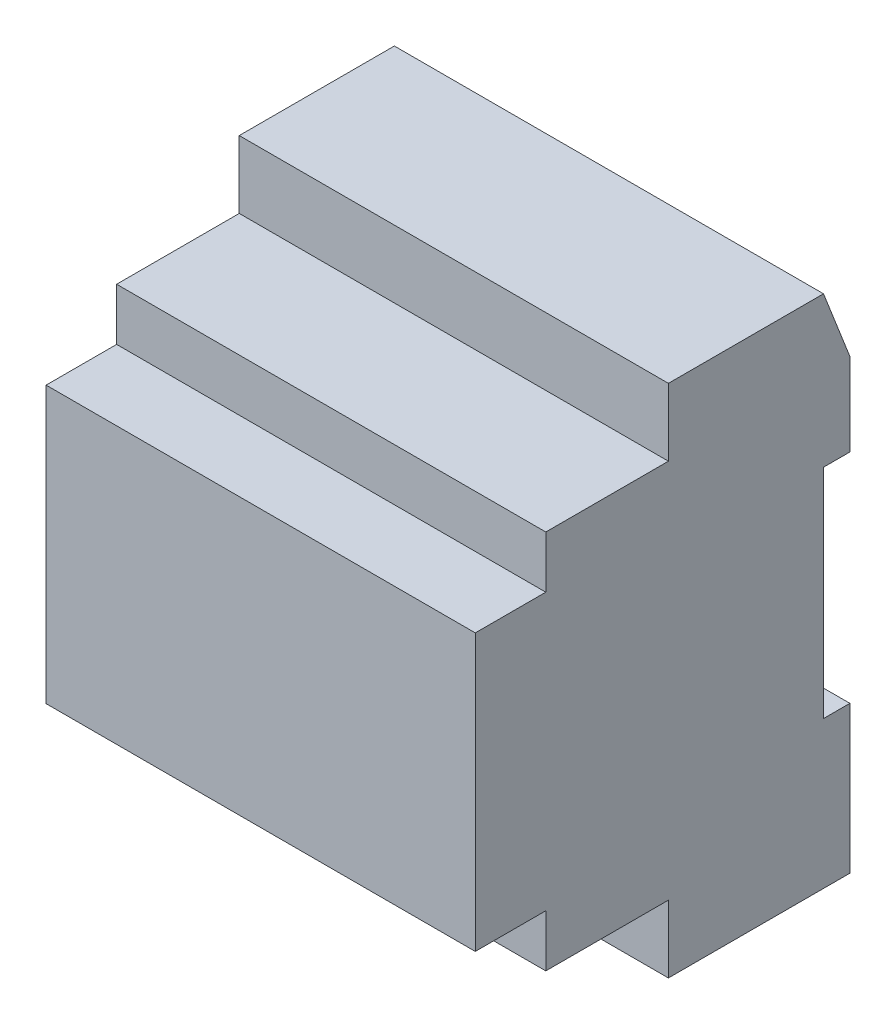
ISO-10303-21;
HEADER;
FILE_DESCRIPTION(('STEP AP214'),'2;1');
FILE_NAME('part.step','',(''),(''),'','','');
FILE_SCHEMA(('AUTOMOTIVE_DESIGN { 1 0 10303 214 1 1 1 1 }'));
ENDSEC;
DATA;
#1=APPLICATION_CONTEXT('core data for automotive mechanical design processes');
#2=APPLICATION_PROTOCOL_DEFINITION('international standard','automotive_design',2000,#1);
#3=PRODUCT_CONTEXT('',#1,'mechanical');
#4=PRODUCT('Part','Part','',(#3));
#5=PRODUCT_RELATED_PRODUCT_CATEGORY('part','',(#4));
#6=PRODUCT_DEFINITION_FORMATION('','',#4);
#7=PRODUCT_DEFINITION_CONTEXT('part definition',#1,'design');
#8=PRODUCT_DEFINITION('design','',#6,#7);
#9=PRODUCT_DEFINITION_SHAPE('','',#8);
#10=(LENGTH_UNIT() NAMED_UNIT(*) SI_UNIT(.MILLI.,.METRE.));
#11=(NAMED_UNIT(*) PLANE_ANGLE_UNIT() SI_UNIT($,.RADIAN.));
#12=(NAMED_UNIT(*) SI_UNIT($,.STERADIAN.) SOLID_ANGLE_UNIT());
#13=UNCERTAINTY_MEASURE_WITH_UNIT(LENGTH_MEASURE(1.E-05),#10,'distance_accuracy_value','');
#14=(GEOMETRIC_REPRESENTATION_CONTEXT(3) GLOBAL_UNCERTAINTY_ASSIGNED_CONTEXT((#13)) GLOBAL_UNIT_ASSIGNED_CONTEXT((#10,
#11,#12)) REPRESENTATION_CONTEXT('',''));
#15=CARTESIAN_POINT('',(0.,0.,0.));
#16=DIRECTION('',(0.,0.,1.));
#17=DIRECTION('',(1.,0.,0.));
#18=AXIS2_PLACEMENT_3D('',#15,#16,#17);
#19=CARTESIAN_POINT('',(70.,0.,29.6));
#20=DIRECTION('',(0.,1.,0.));
#21=DIRECTION('',(0.,0.,1.));
#22=AXIS2_PLACEMENT_3D('',#19,#20,#21);
#23=PLANE('',#22);
#24=DIRECTION('',(0.,0.,-1.));
#25=VECTOR('',#24,1.);
#26=CARTESIAN_POINT('',(15.,0.,0.));
#27=LINE('',#26,#25);
#28=CARTESIAN_POINT('',(15.,0.,4.3));
#29=VERTEX_POINT('',#28);
#30=CARTESIAN_POINT('',(15.,0.,0.));
#31=VERTEX_POINT('',#30);
#32=EDGE_CURVE('E59',#29,#31,#27,.T.);
#33=ORIENTED_EDGE('',*,*,#32,.F.);
#34=DIRECTION('',(-1.,0.,0.));
#35=VECTOR('',#34,1.);
#36=CARTESIAN_POINT('',(15.,0.,4.3));
#37=LINE('',#36,#35);
#38=CARTESIAN_POINT('',(55.,0.,4.3));
#39=VERTEX_POINT('',#38);
#40=EDGE_CURVE('E207',#39,#29,#37,.T.);
#41=ORIENTED_EDGE('',*,*,#40,.F.);
#42=DIRECTION('',(0.,0.,1.));
#43=VECTOR('',#42,1.);
#44=CARTESIAN_POINT('',(55.,0.,0.));
#45=LINE('',#44,#43);
#46=CARTESIAN_POINT('',(55.,0.,0.));
#47=VERTEX_POINT('',#46);
#48=EDGE_CURVE('E704',#47,#39,#45,.T.);
#49=ORIENTED_EDGE('',*,*,#48,.F.);
#50=DIRECTION('',(-1.,0.,0.));
#51=VECTOR('',#50,1.);
#52=CARTESIAN_POINT('',(70.,0.,0.));
#53=LINE('',#52,#51);
#54=CARTESIAN_POINT('',(70.,0.,0.));
#55=VERTEX_POINT('',#54);
#56=EDGE_CURVE('E361',#55,#47,#53,.T.);
#57=ORIENTED_EDGE('',*,*,#56,.F.);
#58=DIRECTION('',(0.,0.,-1.));
#59=VECTOR('',#58,1.);
#60=CARTESIAN_POINT('',(70.,0.,29.6));
#61=LINE('',#60,#59);
#62=CARTESIAN_POINT('',(70.,0.,29.6));
#63=VERTEX_POINT('',#62);
#64=EDGE_CURVE('E242',#63,#55,#61,.T.);
#65=ORIENTED_EDGE('',*,*,#64,.F.);
#66=DIRECTION('',(-1.,0.,0.));
#67=VECTOR('',#66,1.);
#68=CARTESIAN_POINT('',(70.,0.,29.6));
#69=LINE('',#68,#67);
#70=CARTESIAN_POINT('',(0.,0.,29.6));
#71=VERTEX_POINT('',#70);
#72=EDGE_CURVE('E364',#63,#71,#69,.T.);
#73=ORIENTED_EDGE('',*,*,#72,.T.);
#74=DIRECTION('',(0.,0.,-1.));
#75=VECTOR('',#74,1.);
#76=CARTESIAN_POINT('',(0.,0.,29.6));
#77=LINE('',#76,#75);
#78=CARTESIAN_POINT('',(0.,0.,0.));
#79=VERTEX_POINT('',#78);
#80=EDGE_CURVE('E290',#71,#79,#77,.T.);
#81=ORIENTED_EDGE('',*,*,#80,.T.);
#82=EDGE_CURVE('E64',#31,#79,#53,.T.);
#83=ORIENTED_EDGE('',*,*,#82,.F.);
#84=EDGE_LOOP('',(#33,#41,#49,#57,#65,#73,#81,#83));
#85=FACE_BOUND('',#84,.T.);
#86=ADVANCED_FACE('F43',(#85),#23,.F.);
#87=CARTESIAN_POINT('',(70.,64.5,49.6));
#88=DIRECTION('',(0.,-1.,0.));
#89=DIRECTION('',(0.,0.,-1.));
#90=AXIS2_PLACEMENT_3D('',#87,#88,#89);
#91=PLANE('',#90);
#92=DIRECTION('',(0.,0.,1.));
#93=VECTOR('',#92,1.);
#94=CARTESIAN_POINT('',(0.,64.5,49.6));
#95=LINE('',#94,#93);
#96=CARTESIAN_POINT('',(0.,64.5,49.6));
#97=VERTEX_POINT('',#96);
#98=CARTESIAN_POINT('',(0.,64.5,61.1));
#99=VERTEX_POINT('',#98);
#100=EDGE_CURVE('E211',#97,#99,#95,.T.);
#101=ORIENTED_EDGE('',*,*,#100,.T.);
#102=DIRECTION('',(-1.,0.,0.));
#103=VECTOR('',#102,1.);
#104=CARTESIAN_POINT('',(70.,64.5,61.1));
#105=LINE('',#104,#103);
#106=CARTESIAN_POINT('',(70.,64.5,61.1));
#107=VERTEX_POINT('',#106);
#108=EDGE_CURVE('E11',#107,#99,#105,.T.);
#109=ORIENTED_EDGE('',*,*,#108,.F.);
#110=DIRECTION('',(0.,0.,1.));
#111=VECTOR('',#110,1.);
#112=CARTESIAN_POINT('',(70.,64.5,49.6));
#113=LINE('',#112,#111);
#114=CARTESIAN_POINT('',(70.,64.5,49.6));
#115=VERTEX_POINT('',#114);
#116=EDGE_CURVE('E222',#115,#107,#113,.T.);
#117=ORIENTED_EDGE('',*,*,#116,.F.);
#118=DIRECTION('',(-1.,0.,0.));
#119=VECTOR('',#118,1.);
#120=CARTESIAN_POINT('',(70.,64.5,49.6));
#121=LINE('',#120,#119);
#122=EDGE_CURVE('E274',#115,#97,#121,.T.);
#123=ORIENTED_EDGE('',*,*,#122,.T.);
#124=EDGE_LOOP('',(#101,#109,#117,#123));
#125=FACE_BOUND('',#124,.T.);
#126=ADVANCED_FACE('F45',(#125),#91,.F.);
#127=CARTESIAN_POINT('',(70.,64.5,61.1));
#128=DIRECTION('',(0.,0.,-1.));
#129=DIRECTION('',(-1.,0.,0.));
#130=AXIS2_PLACEMENT_3D('',#127,#128,#129);
#131=PLANE('',#130);
#132=DIRECTION('',(0.,-1.,0.));
#133=VECTOR('',#132,1.);
#134=CARTESIAN_POINT('',(0.,64.5,61.1));
#135=LINE('',#134,#133);
#136=CARTESIAN_POINT('',(0.,19.5,61.1));
#137=VERTEX_POINT('',#136);
#138=EDGE_CURVE('E216',#99,#137,#135,.T.);
#139=ORIENTED_EDGE('',*,*,#138,.T.);
#140=DIRECTION('',(-1.,0.,0.));
#141=VECTOR('',#140,1.);
#142=CARTESIAN_POINT('',(70.,19.5,61.1));
#143=LINE('',#142,#141);
#144=CARTESIAN_POINT('',(70.,19.5,61.1));
#145=VERTEX_POINT('',#144);
#146=EDGE_CURVE('E52',#145,#137,#143,.T.);
#147=ORIENTED_EDGE('',*,*,#146,.F.);
#148=DIRECTION('',(0.,-1.,0.));
#149=VECTOR('',#148,1.);
#150=CARTESIAN_POINT('',(70.,64.5,61.1));
#151=LINE('',#150,#149);
#152=EDGE_CURVE('E226',#107,#145,#151,.T.);
#153=ORIENTED_EDGE('',*,*,#152,.F.);
#154=ORIENTED_EDGE('',*,*,#108,.T.);
#155=EDGE_LOOP('',(#139,#147,#153,#154));
#156=FACE_BOUND('',#155,.T.);
#157=ADVANCED_FACE('F408',(#156),#131,.F.);
#158=CARTESIAN_POINT('',(70.,19.5,61.1));
#159=DIRECTION('',(0.,1.,0.));
#160=DIRECTION('',(0.,0.,1.));
#161=AXIS2_PLACEMENT_3D('',#158,#159,#160);
#162=PLANE('',#161);
#163=DIRECTION('',(0.,0.,-1.));
#164=VECTOR('',#163,1.);
#165=CARTESIAN_POINT('',(0.,19.5,61.1));
#166=LINE('',#165,#164);
#167=CARTESIAN_POINT('',(0.,19.5,49.6));
#168=VERTEX_POINT('',#167);
#169=EDGE_CURVE('E278',#137,#168,#166,.T.);
#170=ORIENTED_EDGE('',*,*,#169,.T.);
#171=DIRECTION('',(-1.,0.,0.));
#172=VECTOR('',#171,1.);
#173=CARTESIAN_POINT('',(70.,19.5,49.6));
#174=LINE('',#173,#172);
#175=CARTESIAN_POINT('',(70.,19.5,49.6));
#176=VERTEX_POINT('',#175);
#177=EDGE_CURVE('E376',#176,#168,#174,.T.);
#178=ORIENTED_EDGE('',*,*,#177,.F.);
#179=DIRECTION('',(0.,0.,-1.));
#180=VECTOR('',#179,1.);
#181=CARTESIAN_POINT('',(70.,19.5,61.1));
#182=LINE('',#181,#180);
#183=EDGE_CURVE('E230',#145,#176,#182,.T.);
#184=ORIENTED_EDGE('',*,*,#183,.F.);
#185=ORIENTED_EDGE('',*,*,#146,.T.);
#186=EDGE_LOOP('',(#170,#178,#184,#185));
#187=FACE_BOUND('',#186,.T.);
#188=ADVANCED_FACE('F385',(#187),#162,.F.);
#189=CARTESIAN_POINT('',(70.,19.5,49.6));
#190=DIRECTION('',(0.,0.,-1.));
#191=DIRECTION('',(-1.,0.,0.));
#192=AXIS2_PLACEMENT_3D('',#189,#190,#191);
#193=PLANE('',#192);
#194=DIRECTION('',(0.,-1.,0.));
#195=VECTOR('',#194,1.);
#196=CARTESIAN_POINT('',(0.,19.5,49.6));
#197=LINE('',#196,#195);
#198=CARTESIAN_POINT('',(0.,11.,49.6));
#199=VERTEX_POINT('',#198);
#200=EDGE_CURVE('E281',#168,#199,#197,.T.);
#201=ORIENTED_EDGE('',*,*,#200,.T.);
#202=DIRECTION('',(-1.,0.,0.));
#203=VECTOR('',#202,1.);
#204=CARTESIAN_POINT('',(70.,11.,49.6));
#205=LINE('',#204,#203);
#206=CARTESIAN_POINT('',(70.,11.,49.6));
#207=VERTEX_POINT('',#206);
#208=EDGE_CURVE('E372',#207,#199,#205,.T.);
#209=ORIENTED_EDGE('',*,*,#208,.F.);
#210=DIRECTION('',(0.,-1.,0.));
#211=VECTOR('',#210,1.);
#212=CARTESIAN_POINT('',(70.,19.5,49.6));
#213=LINE('',#212,#211);
#214=EDGE_CURVE('E233',#176,#207,#213,.T.);
#215=ORIENTED_EDGE('',*,*,#214,.F.);
#216=ORIENTED_EDGE('',*,*,#177,.T.);
#217=EDGE_LOOP('',(#201,#209,#215,#216));
#218=FACE_BOUND('',#217,.T.);
#219=ADVANCED_FACE('F396',(#218),#193,.F.);
#220=CARTESIAN_POINT('',(70.,11.,49.6));
#221=DIRECTION('',(0.,1.,0.));
#222=DIRECTION('',(0.,0.,1.));
#223=AXIS2_PLACEMENT_3D('',#220,#221,#222);
#224=PLANE('',#223);
#225=DIRECTION('',(0.,0.,-1.));
#226=VECTOR('',#225,1.);
#227=CARTESIAN_POINT('',(0.,11.,49.6));
#228=LINE('',#227,#226);
#229=CARTESIAN_POINT('',(0.,11.,29.6));
#230=VERTEX_POINT('',#229);
#231=EDGE_CURVE('E284',#199,#230,#228,.T.);
#232=ORIENTED_EDGE('',*,*,#231,.T.);
#233=DIRECTION('',(-1.,0.,0.));
#234=VECTOR('',#233,1.);
#235=CARTESIAN_POINT('',(70.,11.,29.6));
#236=LINE('',#235,#234);
#237=CARTESIAN_POINT('',(70.,11.,29.6));
#238=VERTEX_POINT('',#237);
#239=EDGE_CURVE('E368',#238,#230,#236,.T.);
#240=ORIENTED_EDGE('',*,*,#239,.F.);
#241=DIRECTION('',(0.,0.,-1.));
#242=VECTOR('',#241,1.);
#243=CARTESIAN_POINT('',(70.,11.,49.6));
#244=LINE('',#243,#242);
#245=EDGE_CURVE('E236',#207,#238,#244,.T.);
#246=ORIENTED_EDGE('',*,*,#245,.F.);
#247=ORIENTED_EDGE('',*,*,#208,.T.);
#248=EDGE_LOOP('',(#232,#240,#246,#247));
#249=FACE_BOUND('',#248,.T.);
#250=ADVANCED_FACE('F400',(#249),#224,.F.);
#251=CARTESIAN_POINT('',(70.,11.,29.6));
#252=DIRECTION('',(0.,0.,-1.));
#253=DIRECTION('',(-1.,0.,0.));
#254=AXIS2_PLACEMENT_3D('',#251,#252,#253);
#255=PLANE('',#254);
#256=DIRECTION('',(0.,-1.,0.));
#257=VECTOR('',#256,1.);
#258=CARTESIAN_POINT('',(0.,11.,29.6));
#259=LINE('',#258,#257);
#260=EDGE_CURVE('E287',#230,#71,#259,.T.);
#261=ORIENTED_EDGE('',*,*,#260,.T.);
#262=ORIENTED_EDGE('',*,*,#72,.F.);
#263=DIRECTION('',(0.,-1.,0.));
#264=VECTOR('',#263,1.);
#265=CARTESIAN_POINT('',(70.,11.,29.6));
#266=LINE('',#265,#264);
#267=EDGE_CURVE('E239',#238,#63,#266,.T.);
#268=ORIENTED_EDGE('',*,*,#267,.F.);
#269=ORIENTED_EDGE('',*,*,#239,.T.);
#270=EDGE_LOOP('',(#261,#262,#268,#269));
#271=FACE_BOUND('',#270,.T.);
#272=ADVANCED_FACE('F463',(#271),#255,.F.);
#273=CARTESIAN_POINT('',(70.,0.,0.));
#274=DIRECTION('',(0.,0.,1.));
#275=DIRECTION('',(1.,0.,0.));
#276=AXIS2_PLACEMENT_3D('',#273,#274,#275);
#277=PLANE('',#276);
#278=DIRECTION('',(0.,1.,0.));
#279=VECTOR('',#278,1.);
#280=CARTESIAN_POINT('',(0.,0.,0.));
#281=LINE('',#280,#279);
#282=CARTESIAN_POINT('',(0.,24.,0.));
#283=VERTEX_POINT('',#282);
#284=EDGE_CURVE('E293',#79,#283,#281,.T.);
#285=ORIENTED_EDGE('',*,*,#284,.T.);
#286=DIRECTION('',(-1.,0.,0.));
#287=VECTOR('',#286,1.);
#288=CARTESIAN_POINT('',(70.,24.,0.));
#289=LINE('',#288,#287);
#290=CARTESIAN_POINT('',(70.,24.,0.));
#291=VERTEX_POINT('',#290);
#292=EDGE_CURVE('E357',#291,#283,#289,.T.);
#293=ORIENTED_EDGE('',*,*,#292,.F.);
#294=DIRECTION('',(0.,1.,0.));
#295=VECTOR('',#294,1.);
#296=CARTESIAN_POINT('',(70.,0.,0.));
#297=LINE('',#296,#295);
#298=EDGE_CURVE('E245',#55,#291,#297,.T.);
#299=ORIENTED_EDGE('',*,*,#298,.F.);
#300=ORIENTED_EDGE('',*,*,#56,.T.);
#301=DIRECTION('',(0.,1.,0.));
#302=VECTOR('',#301,1.);
#303=CARTESIAN_POINT('',(55.,-4.8,0.));
#304=LINE('',#303,#302);
#305=CARTESIAN_POINT('',(55.,-4.8,0.));
#306=VERTEX_POINT('',#305);
#307=EDGE_CURVE('E192',#306,#47,#304,.T.);
#308=ORIENTED_EDGE('',*,*,#307,.F.);
#309=DIRECTION('',(1.,0.,0.));
#310=VECTOR('',#309,1.);
#311=CARTESIAN_POINT('',(15.,-4.8,0.));
#312=LINE('',#311,#310);
#313=CARTESIAN_POINT('',(15.,-4.8,0.));
#314=VERTEX_POINT('',#313);
#315=EDGE_CURVE('E185',#314,#306,#312,.T.);
#316=ORIENTED_EDGE('',*,*,#315,.F.);
#317=DIRECTION('',(0.,1.,0.));
#318=VECTOR('',#317,1.);
#319=CARTESIAN_POINT('',(15.,-4.8,0.));
#320=LINE('',#319,#318);
#321=EDGE_CURVE('E189',#314,#31,#320,.T.);
#322=ORIENTED_EDGE('',*,*,#321,.T.);
#323=ORIENTED_EDGE('',*,*,#82,.T.);
#324=EDGE_LOOP('',(#285,#293,#299,#300,#308,#316,#322,#323));
#325=FACE_BOUND('',#324,.T.);
#326=ADVANCED_FACE('F187',(#325),#277,.F.);
#327=CARTESIAN_POINT('',(70.,24.,0.));
#328=DIRECTION('',(0.,-1.,0.));
#329=DIRECTION('',(0.,0.,-1.));
#330=AXIS2_PLACEMENT_3D('',#327,#328,#329);
#331=PLANE('',#330);
#332=DIRECTION('',(0.,0.,1.));
#333=VECTOR('',#332,1.);
#334=CARTESIAN_POINT('',(0.,24.,0.));
#335=LINE('',#334,#333);
#336=CARTESIAN_POINT('',(0.,24.,4.30000000000001));
#337=VERTEX_POINT('',#336);
#338=EDGE_CURVE('E296',#283,#337,#335,.T.);
#339=ORIENTED_EDGE('',*,*,#338,.T.);
#340=DIRECTION('',(-1.,0.,0.));
#341=VECTOR('',#340,1.);
#342=CARTESIAN_POINT('',(70.,24.,4.30000000000001));
#343=LINE('',#342,#341);
#344=CARTESIAN_POINT('',(70.,24.,4.30000000000001));
#345=VERTEX_POINT('',#344);
#346=EDGE_CURVE('E353',#345,#337,#343,.T.);
#347=ORIENTED_EDGE('',*,*,#346,.F.);
#348=DIRECTION('',(0.,0.,1.));
#349=VECTOR('',#348,1.);
#350=CARTESIAN_POINT('',(70.,24.,0.));
#351=LINE('',#350,#349);
#352=EDGE_CURVE('E248',#291,#345,#351,.T.);
#353=ORIENTED_EDGE('',*,*,#352,.F.);
#354=ORIENTED_EDGE('',*,*,#292,.T.);
#355=EDGE_LOOP('',(#339,#347,#353,#354));
#356=FACE_BOUND('',#355,.T.);
#357=ADVANCED_FACE('F454',(#356),#331,.F.);
#358=CARTESIAN_POINT('',(70.,24.,4.30000000000001));
#359=DIRECTION('',(0.,0.,1.));
#360=DIRECTION('',(0.,-1.,0.));
#361=AXIS2_PLACEMENT_3D('',#358,#359,#360);
#362=PLANE('',#361);
#363=DIRECTION('',(0.,1.,0.));
#364=VECTOR('',#363,1.);
#365=CARTESIAN_POINT('',(0.,24.,4.30000000000001));
#366=LINE('',#365,#364);
#367=CARTESIAN_POINT('',(0.,59.5,4.30000000000002));
#368=VERTEX_POINT('',#367);
#369=EDGE_CURVE('E299',#337,#368,#366,.T.);
#370=ORIENTED_EDGE('',*,*,#369,.T.);
#371=DIRECTION('',(-1.,0.,0.));
#372=VECTOR('',#371,1.);
#373=CARTESIAN_POINT('',(70.,59.5,4.30000000000002));
#374=LINE('',#373,#372);
#375=CARTESIAN_POINT('',(70.,59.5,4.30000000000002));
#376=VERTEX_POINT('',#375);
#377=EDGE_CURVE('E349',#376,#368,#374,.T.);
#378=ORIENTED_EDGE('',*,*,#377,.F.);
#379=DIRECTION('',(0.,1.,0.));
#380=VECTOR('',#379,1.);
#381=CARTESIAN_POINT('',(70.,24.,4.30000000000001));
#382=LINE('',#381,#380);
#383=EDGE_CURVE('E251',#345,#376,#382,.T.);
#384=ORIENTED_EDGE('',*,*,#383,.F.);
#385=ORIENTED_EDGE('',*,*,#346,.T.);
#386=EDGE_LOOP('',(#370,#378,#384,#385));
#387=FACE_BOUND('',#386,.T.);
#388=ADVANCED_FACE('F450',(#387),#362,.F.);
#389=CARTESIAN_POINT('',(70.,59.5,4.30000000000002));
#390=DIRECTION('',(0.,1.,0.));
#391=DIRECTION('',(0.,0.,1.));
#392=AXIS2_PLACEMENT_3D('',#389,#390,#391);
#393=PLANE('',#392);
#394=DIRECTION('',(0.,0.,-1.));
#395=VECTOR('',#394,1.);
#396=CARTESIAN_POINT('',(0.,59.5,4.30000000000002));
#397=LINE('',#396,#395);
#398=CARTESIAN_POINT('',(0.,59.5,0.));
#399=VERTEX_POINT('',#398);
#400=EDGE_CURVE('E302',#368,#399,#397,.T.);
#401=ORIENTED_EDGE('',*,*,#400,.T.);
#402=DIRECTION('',(-1.,0.,0.));
#403=VECTOR('',#402,1.);
#404=CARTESIAN_POINT('',(70.,59.5,0.));
#405=LINE('',#404,#403);
#406=CARTESIAN_POINT('',(70.,59.5,0.));
#407=VERTEX_POINT('',#406);
#408=EDGE_CURVE('E345',#407,#399,#405,.T.);
#409=ORIENTED_EDGE('',*,*,#408,.F.);
#410=DIRECTION('',(0.,0.,-1.));
#411=VECTOR('',#410,1.);
#412=CARTESIAN_POINT('',(70.,59.5,4.30000000000002));
#413=LINE('',#412,#411);
#414=EDGE_CURVE('E254',#376,#407,#413,.T.);
#415=ORIENTED_EDGE('',*,*,#414,.F.);
#416=ORIENTED_EDGE('',*,*,#377,.T.);
#417=EDGE_LOOP('',(#401,#409,#415,#416));
#418=FACE_BOUND('',#417,.T.);
#419=ADVANCED_FACE('F445',(#418),#393,.F.);
#420=CARTESIAN_POINT('',(70.,59.5,0.));
#421=DIRECTION('',(0.,0.,1.));
#422=DIRECTION('',(1.,0.,0.));
#423=AXIS2_PLACEMENT_3D('',#420,#421,#422);
#424=PLANE('',#423);
#425=DIRECTION('',(0.,1.,0.));
#426=VECTOR('',#425,1.);
#427=CARTESIAN_POINT('',(0.,59.5,0.));
#428=LINE('',#427,#426);
#429=CARTESIAN_POINT('',(0.,73.,0.));
#430=VERTEX_POINT('',#429);
#431=EDGE_CURVE('E305',#399,#430,#428,.T.);
#432=ORIENTED_EDGE('',*,*,#431,.T.);
#433=DIRECTION('',(-1.,0.,0.));
#434=VECTOR('',#433,1.);
#435=CARTESIAN_POINT('',(70.,73.,0.));
#436=LINE('',#435,#434);
#437=CARTESIAN_POINT('',(70.,73.,0.));
#438=VERTEX_POINT('',#437);
#439=EDGE_CURVE('E341',#438,#430,#436,.T.);
#440=ORIENTED_EDGE('',*,*,#439,.F.);
#441=DIRECTION('',(0.,1.,0.));
#442=VECTOR('',#441,1.);
#443=CARTESIAN_POINT('',(70.,59.5,0.));
#444=LINE('',#443,#442);
#445=EDGE_CURVE('E257',#407,#438,#444,.T.);
#446=ORIENTED_EDGE('',*,*,#445,.F.);
#447=ORIENTED_EDGE('',*,*,#408,.T.);
#448=EDGE_LOOP('',(#432,#440,#446,#447));
#449=FACE_BOUND('',#448,.T.);
#450=ADVANCED_FACE('F439',(#449),#424,.F.);
#451=CARTESIAN_POINT('',(70.,73.,0.));
#452=DIRECTION('',(0.,-0.364080080432999,0.931367647619296));
#453=DIRECTION('',(0.,-0.931367647619296,-0.364080080432999));
#454=AXIS2_PLACEMENT_3D('',#451,#452,#453);
#455=PLANE('',#454);
#456=DIRECTION('',(0.,0.931367647619296,0.364080080432999));
#457=VECTOR('',#456,1.);
#458=CARTESIAN_POINT('',(0.,73.,0.));
#459=LINE('',#458,#457);
#460=CARTESIAN_POINT('',(0.,84.,4.30000000000002));
#461=VERTEX_POINT('',#460);
#462=EDGE_CURVE('E308',#430,#461,#459,.T.);
#463=ORIENTED_EDGE('',*,*,#462,.T.);
#464=DIRECTION('',(-1.,0.,0.));
#465=VECTOR('',#464,1.);
#466=CARTESIAN_POINT('',(70.,84.,4.30000000000002));
#467=LINE('',#466,#465);
#468=CARTESIAN_POINT('',(70.,84.,4.30000000000002));
#469=VERTEX_POINT('',#468);
#470=EDGE_CURVE('E337',#469,#461,#467,.T.);
#471=ORIENTED_EDGE('',*,*,#470,.F.);
#472=DIRECTION('',(0.,0.931367647619296,0.364080080432999));
#473=VECTOR('',#472,1.);
#474=CARTESIAN_POINT('',(70.,73.,0.));
#475=LINE('',#474,#473);
#476=EDGE_CURVE('E260',#438,#469,#475,.T.);
#477=ORIENTED_EDGE('',*,*,#476,.F.);
#478=ORIENTED_EDGE('',*,*,#439,.T.);
#479=EDGE_LOOP('',(#463,#471,#477,#478));
#480=FACE_BOUND('',#479,.T.);
#481=ADVANCED_FACE('F435',(#480),#455,.F.);
#482=CARTESIAN_POINT('',(70.,84.,4.30000000000002));
#483=DIRECTION('',(0.,-1.,0.));
#484=DIRECTION('',(0.,0.,-1.));
#485=AXIS2_PLACEMENT_3D('',#482,#483,#484);
#486=PLANE('',#485);
#487=DIRECTION('',(0.,0.,1.));
#488=VECTOR('',#487,1.);
#489=CARTESIAN_POINT('',(0.,84.,4.30000000000002));
#490=LINE('',#489,#488);
#491=CARTESIAN_POINT('',(0.,84.,29.6));
#492=VERTEX_POINT('',#491);
#493=EDGE_CURVE('E311',#461,#492,#490,.T.);
#494=ORIENTED_EDGE('',*,*,#493,.T.);
#495=DIRECTION('',(-1.,0.,0.));
#496=VECTOR('',#495,1.);
#497=CARTESIAN_POINT('',(70.,84.,29.6));
#498=LINE('',#497,#496);
#499=CARTESIAN_POINT('',(70.,84.,29.6));
#500=VERTEX_POINT('',#499);
#501=EDGE_CURVE('E333',#500,#492,#498,.T.);
#502=ORIENTED_EDGE('',*,*,#501,.F.);
#503=DIRECTION('',(0.,0.,1.));
#504=VECTOR('',#503,1.);
#505=CARTESIAN_POINT('',(70.,84.,4.30000000000002));
#506=LINE('',#505,#504);
#507=EDGE_CURVE('E263',#469,#500,#506,.T.);
#508=ORIENTED_EDGE('',*,*,#507,.F.);
#509=ORIENTED_EDGE('',*,*,#470,.T.);
#510=EDGE_LOOP('',(#494,#502,#508,#509));
#511=FACE_BOUND('',#510,.T.);
#512=ADVANCED_FACE('F430',(#511),#486,.F.);
#513=CARTESIAN_POINT('',(70.,84.,29.6));
#514=DIRECTION('',(0.,0.,-1.));
#515=DIRECTION('',(0.,1.,0.));
#516=AXIS2_PLACEMENT_3D('',#513,#514,#515);
#517=PLANE('',#516);
#518=DIRECTION('',(0.,-1.,0.));
#519=VECTOR('',#518,1.);
#520=CARTESIAN_POINT('',(0.,84.,29.6));
#521=LINE('',#520,#519);
#522=CARTESIAN_POINT('',(0.,73.,29.6));
#523=VERTEX_POINT('',#522);
#524=EDGE_CURVE('E314',#492,#523,#521,.T.);
#525=ORIENTED_EDGE('',*,*,#524,.T.);
#526=DIRECTION('',(-1.,0.,0.));
#527=VECTOR('',#526,1.);
#528=CARTESIAN_POINT('',(70.,73.,29.6));
#529=LINE('',#528,#527);
#530=CARTESIAN_POINT('',(70.,73.,29.6));
#531=VERTEX_POINT('',#530);
#532=EDGE_CURVE('E329',#531,#523,#529,.T.);
#533=ORIENTED_EDGE('',*,*,#532,.F.);
#534=DIRECTION('',(0.,-1.,0.));
#535=VECTOR('',#534,1.);
#536=CARTESIAN_POINT('',(70.,84.,29.6));
#537=LINE('',#536,#535);
#538=EDGE_CURVE('E266',#500,#531,#537,.T.);
#539=ORIENTED_EDGE('',*,*,#538,.F.);
#540=ORIENTED_EDGE('',*,*,#501,.T.);
#541=EDGE_LOOP('',(#525,#533,#539,#540));
#542=FACE_BOUND('',#541,.T.);
#543=ADVANCED_FACE('F424',(#542),#517,.F.);
#544=CARTESIAN_POINT('',(70.,73.,29.6));
#545=DIRECTION('',(0.,-1.,0.));
#546=DIRECTION('',(0.,0.,-1.));
#547=AXIS2_PLACEMENT_3D('',#544,#545,#546);
#548=PLANE('',#547);
#549=DIRECTION('',(0.,0.,1.));
#550=VECTOR('',#549,1.);
#551=CARTESIAN_POINT('',(0.,73.,29.6));
#552=LINE('',#551,#550);
#553=CARTESIAN_POINT('',(0.,73.,49.6));
#554=VERTEX_POINT('',#553);
#555=EDGE_CURVE('E317',#523,#554,#552,.T.);
#556=ORIENTED_EDGE('',*,*,#555,.T.);
#557=DIRECTION('',(-1.,0.,0.));
#558=VECTOR('',#557,1.);
#559=CARTESIAN_POINT('',(70.,73.,49.6));
#560=LINE('',#559,#558);
#561=CARTESIAN_POINT('',(70.,73.,49.6));
#562=VERTEX_POINT('',#561);
#563=EDGE_CURVE('E325',#562,#554,#560,.T.);
#564=ORIENTED_EDGE('',*,*,#563,.F.);
#565=DIRECTION('',(0.,0.,1.));
#566=VECTOR('',#565,1.);
#567=CARTESIAN_POINT('',(70.,73.,29.6));
#568=LINE('',#567,#566);
#569=EDGE_CURVE('E269',#531,#562,#568,.T.);
#570=ORIENTED_EDGE('',*,*,#569,.F.);
#571=ORIENTED_EDGE('',*,*,#532,.T.);
#572=EDGE_LOOP('',(#556,#564,#570,#571));
#573=FACE_BOUND('',#572,.T.);
#574=ADVANCED_FACE('F420',(#573),#548,.F.);
#575=CARTESIAN_POINT('',(70.,73.,49.6));
#576=DIRECTION('',(0.,0.,-1.));
#577=DIRECTION('',(0.,1.,0.));
#578=AXIS2_PLACEMENT_3D('',#575,#576,#577);
#579=PLANE('',#578);
#580=DIRECTION('',(0.,-1.,0.));
#581=VECTOR('',#580,1.);
#582=CARTESIAN_POINT('',(0.,73.,49.6));
#583=LINE('',#582,#581);
#584=EDGE_CURVE('E227',#554,#97,#583,.T.);
#585=ORIENTED_EDGE('',*,*,#584,.T.);
#586=ORIENTED_EDGE('',*,*,#122,.F.);
#587=DIRECTION('',(0.,-1.,0.));
#588=VECTOR('',#587,1.);
#589=CARTESIAN_POINT('',(70.,73.,49.6));
#590=LINE('',#589,#588);
#591=EDGE_CURVE('E272',#562,#115,#590,.T.);
#592=ORIENTED_EDGE('',*,*,#591,.F.);
#593=ORIENTED_EDGE('',*,*,#563,.T.);
#594=EDGE_LOOP('',(#585,#586,#592,#593));
#595=FACE_BOUND('',#594,.T.);
#596=ADVANCED_FACE('F415',(#595),#579,.F.);
#597=CARTESIAN_POINT('',(70.,0.,0.));
#598=DIRECTION('',(1.,0.,0.));
#599=DIRECTION('',(0.,0.,-1.));
#600=AXIS2_PLACEMENT_3D('',#597,#598,#599);
#601=PLANE('',#600);
#602=ORIENTED_EDGE('',*,*,#116,.T.);
#603=ORIENTED_EDGE('',*,*,#152,.T.);
#604=ORIENTED_EDGE('',*,*,#183,.T.);
#605=ORIENTED_EDGE('',*,*,#214,.T.);
#606=ORIENTED_EDGE('',*,*,#245,.T.);
#607=ORIENTED_EDGE('',*,*,#267,.T.);
#608=ORIENTED_EDGE('',*,*,#64,.T.);
#609=ORIENTED_EDGE('',*,*,#298,.T.);
#610=ORIENTED_EDGE('',*,*,#352,.T.);
#611=ORIENTED_EDGE('',*,*,#383,.T.);
#612=ORIENTED_EDGE('',*,*,#414,.T.);
#613=ORIENTED_EDGE('',*,*,#445,.T.);
#614=ORIENTED_EDGE('',*,*,#476,.T.);
#615=ORIENTED_EDGE('',*,*,#507,.T.);
#616=ORIENTED_EDGE('',*,*,#538,.T.);
#617=ORIENTED_EDGE('',*,*,#569,.T.);
#618=ORIENTED_EDGE('',*,*,#591,.T.);
#619=EDGE_LOOP('',(#602,#603,#604,#605,#606,#607,#608,#609,#610,#611,#612,#613,#614,#615,#616,
#617,#618));
#620=FACE_BOUND('',#619,.T.);
#621=ADVANCED_FACE('F404',(#620),#601,.T.);
#622=CARTESIAN_POINT('',(0.,0.,0.));
#623=DIRECTION('',(1.,0.,0.));
#624=DIRECTION('',(0.,0.,-1.));
#625=AXIS2_PLACEMENT_3D('',#622,#623,#624);
#626=PLANE('',#625);
#627=ORIENTED_EDGE('',*,*,#100,.F.);
#628=ORIENTED_EDGE('',*,*,#584,.F.);
#629=ORIENTED_EDGE('',*,*,#555,.F.);
#630=ORIENTED_EDGE('',*,*,#524,.F.);
#631=ORIENTED_EDGE('',*,*,#493,.F.);
#632=ORIENTED_EDGE('',*,*,#462,.F.);
#633=ORIENTED_EDGE('',*,*,#431,.F.);
#634=ORIENTED_EDGE('',*,*,#400,.F.);
#635=ORIENTED_EDGE('',*,*,#369,.F.);
#636=ORIENTED_EDGE('',*,*,#338,.F.);
#637=ORIENTED_EDGE('',*,*,#284,.F.);
#638=ORIENTED_EDGE('',*,*,#80,.F.);
#639=ORIENTED_EDGE('',*,*,#260,.F.);
#640=ORIENTED_EDGE('',*,*,#231,.F.);
#641=ORIENTED_EDGE('',*,*,#200,.F.);
#642=ORIENTED_EDGE('',*,*,#169,.F.);
#643=ORIENTED_EDGE('',*,*,#138,.F.);
#644=EDGE_LOOP('',(#627,#628,#629,#630,#631,#632,#633,#634,#635,#636,#637,#638,#639,#640,#641,
#642,#643));
#645=FACE_BOUND('',#644,.T.);
#646=ADVANCED_FACE('F391',(#645),#626,.F.);
#647=CARTESIAN_POINT('',(15.,-4.8,0.));
#648=DIRECTION('',(1.,0.,0.));
#649=DIRECTION('',(0.,0.,-1.));
#650=AXIS2_PLACEMENT_3D('',#647,#648,#649);
#651=PLANE('',#650);
#652=ORIENTED_EDGE('',*,*,#32,.T.);
#653=ORIENTED_EDGE('',*,*,#321,.F.);
#654=DIRECTION('',(0.,0.,-1.));
#655=VECTOR('',#654,1.);
#656=CARTESIAN_POINT('',(15.,-4.8,0.));
#657=LINE('',#656,#655);
#658=CARTESIAN_POINT('',(15.,-4.8,4.3));
#659=VERTEX_POINT('',#658);
#660=EDGE_CURVE('E197',#659,#314,#657,.T.);
#661=ORIENTED_EDGE('',*,*,#660,.F.);
#662=DIRECTION('',(0.,1.,0.));
#663=VECTOR('',#662,1.);
#664=CARTESIAN_POINT('',(15.,-4.8,4.3));
#665=LINE('',#664,#663);
#666=EDGE_CURVE('E700',#659,#29,#665,.T.);
#667=ORIENTED_EDGE('',*,*,#666,.T.);
#668=EDGE_LOOP('',(#652,#653,#661,#667));
#669=FACE_BOUND('',#668,.T.);
#670=ADVANCED_FACE('F209',(#669),#651,.F.);
#671=CARTESIAN_POINT('',(55.,-4.8,0.));
#672=DIRECTION('',(-1.,0.,0.));
#673=DIRECTION('',(0.,0.,1.));
#674=AXIS2_PLACEMENT_3D('',#671,#672,#673);
#675=PLANE('',#674);
#676=ORIENTED_EDGE('',*,*,#48,.T.);
#677=DIRECTION('',(0.,1.,0.));
#678=VECTOR('',#677,1.);
#679=CARTESIAN_POINT('',(55.,-4.8,4.3));
#680=LINE('',#679,#678);
#681=CARTESIAN_POINT('',(55.,-4.8,4.3));
#682=VERTEX_POINT('',#681);
#683=EDGE_CURVE('E218',#682,#39,#680,.T.);
#684=ORIENTED_EDGE('',*,*,#683,.F.);
#685=DIRECTION('',(0.,0.,1.));
#686=VECTOR('',#685,1.);
#687=CARTESIAN_POINT('',(55.,-4.8,0.));
#688=LINE('',#687,#686);
#689=EDGE_CURVE('E196',#306,#682,#688,.T.);
#690=ORIENTED_EDGE('',*,*,#689,.F.);
#691=ORIENTED_EDGE('',*,*,#307,.T.);
#692=EDGE_LOOP('',(#676,#684,#690,#691));
#693=FACE_BOUND('',#692,.T.);
#694=ADVANCED_FACE('F502',(#693),#675,.F.);
#695=CARTESIAN_POINT('',(15.,-4.8,4.3));
#696=DIRECTION('',(0.,0.,-1.));
#697=DIRECTION('',(0.,1.,0.));
#698=AXIS2_PLACEMENT_3D('',#695,#696,#697);
#699=PLANE('',#698);
#700=ORIENTED_EDGE('',*,*,#40,.T.);
#701=ORIENTED_EDGE('',*,*,#666,.F.);
#702=DIRECTION('',(-1.,0.,0.));
#703=VECTOR('',#702,1.);
#704=CARTESIAN_POINT('',(15.,-4.8,4.3));
#705=LINE('',#704,#703);
#706=EDGE_CURVE('E202',#682,#659,#705,.T.);
#707=ORIENTED_EDGE('',*,*,#706,.F.);
#708=ORIENTED_EDGE('',*,*,#683,.T.);
#709=EDGE_LOOP('',(#700,#701,#707,#708));
#710=FACE_BOUND('',#709,.T.);
#711=ADVANCED_FACE('F505',(#710),#699,.F.);
#712=CARTESIAN_POINT('',(0.,-4.8,0.));
#713=DIRECTION('',(0.,1.,0.));
#714=DIRECTION('',(0.,0.,1.));
#715=AXIS2_PLACEMENT_3D('',#712,#713,#714);
#716=PLANE('',#715);
#717=ORIENTED_EDGE('',*,*,#660,.T.);
#718=ORIENTED_EDGE('',*,*,#315,.T.);
#719=ORIENTED_EDGE('',*,*,#689,.T.);
#720=ORIENTED_EDGE('',*,*,#706,.T.);
#721=EDGE_LOOP('',(#717,#718,#719,#720));
#722=FACE_BOUND('',#721,.T.);
#723=ADVANCED_FACE('F200',(#722),#716,.F.);
#724=CLOSED_SHELL('',(#86,#126,#157,#188,#219,#250,#272,#326,#357,#388,#419,#450,#481,#512,#543,
#574,#596,#621,#646,#670,#694,#711,#723));
#725=MANIFOLD_SOLID_BREP('B2',#724);
#726=ADVANCED_BREP_SHAPE_REPRESENTATION('',(#18,#725),#14);
#727=SHAPE_DEFINITION_REPRESENTATION(#9,#726);
ENDSEC;
END-ISO-10303-21;
